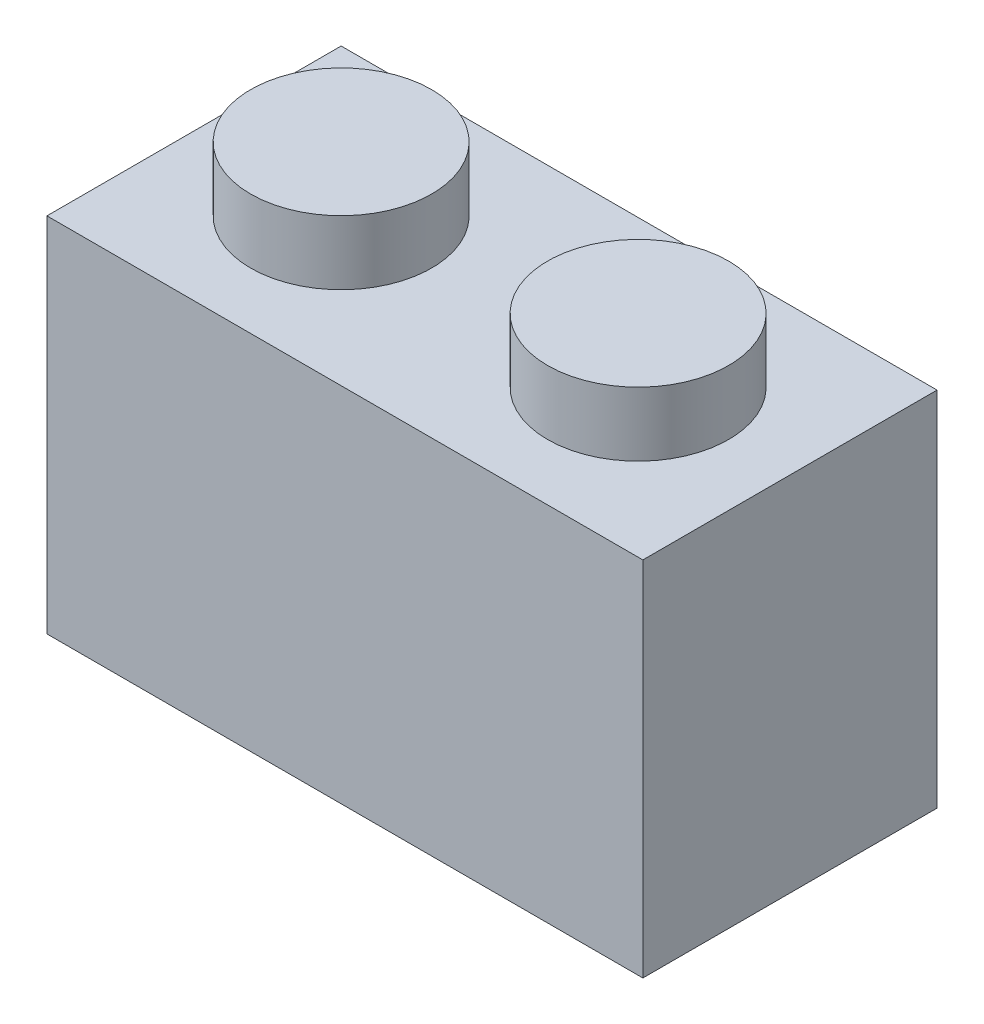
ISO-10303-21;
HEADER;
FILE_DESCRIPTION(('STEP AP214'),'2;1');
FILE_NAME('part.step','',(''),(''),'','','');
FILE_SCHEMA(('AUTOMOTIVE_DESIGN { 1 0 10303 214 1 1 1 1 }'));
ENDSEC;
DATA;
#1=APPLICATION_CONTEXT('core data for automotive mechanical design processes');
#2=APPLICATION_PROTOCOL_DEFINITION('international standard','automotive_design',2000,#1);
#3=PRODUCT_CONTEXT('',#1,'mechanical');
#4=PRODUCT('Part','Part','',(#3));
#5=PRODUCT_RELATED_PRODUCT_CATEGORY('part','',(#4));
#6=PRODUCT_DEFINITION_FORMATION('','',#4);
#7=PRODUCT_DEFINITION_CONTEXT('part definition',#1,'design');
#8=PRODUCT_DEFINITION('design','',#6,#7);
#9=PRODUCT_DEFINITION_SHAPE('','',#8);
#10=(LENGTH_UNIT() NAMED_UNIT(*) SI_UNIT(.MILLI.,.METRE.));
#11=(NAMED_UNIT(*) PLANE_ANGLE_UNIT() SI_UNIT($,.RADIAN.));
#12=(NAMED_UNIT(*) SI_UNIT($,.STERADIAN.) SOLID_ANGLE_UNIT());
#13=UNCERTAINTY_MEASURE_WITH_UNIT(LENGTH_MEASURE(1.E-05),#10,'distance_accuracy_value','');
#14=(GEOMETRIC_REPRESENTATION_CONTEXT(3) GLOBAL_UNCERTAINTY_ASSIGNED_CONTEXT((#13)) GLOBAL_UNIT_ASSIGNED_CONTEXT((#10,
#11,#12)) REPRESENTATION_CONTEXT('',''));
#15=CARTESIAN_POINT('',(0.,0.,0.));
#16=DIRECTION('',(0.,0.,1.));
#17=DIRECTION('',(1.,0.,0.));
#18=AXIS2_PLACEMENT_3D('',#15,#16,#17);
#19=CARTESIAN_POINT('',(-7.90000000000003,9.6,3.89999994699998));
#20=DIRECTION('',(1.,0.,0.));
#21=DIRECTION('',(0.,0.,-1.));
#22=AXIS2_PLACEMENT_3D('',#19,#20,#21);
#23=PLANE('',#22);
#24=DIRECTION('',(0.,0.,1.));
#25=VECTOR('',#24,1.);
#26=CARTESIAN_POINT('',(-7.90000000000003,0.,3.89999994699998));
#27=LINE('',#26,#25);
#28=CARTESIAN_POINT('',(-7.90000000000003,0.,-3.89999994700002));
#29=VERTEX_POINT('',#28);
#30=CARTESIAN_POINT('',(-7.90000000000003,0.,3.89999994699998));
#31=VERTEX_POINT('',#30);
#32=EDGE_CURVE('E96',#29,#31,#27,.T.);
#33=ORIENTED_EDGE('',*,*,#32,.T.);
#34=DIRECTION('',(0.,-1.,0.));
#35=VECTOR('',#34,1.);
#36=CARTESIAN_POINT('',(-7.90000000000003,9.6,3.89999994699998));
#37=LINE('',#36,#35);
#38=CARTESIAN_POINT('',(-7.90000000000003,9.6,3.89999994699998));
#39=VERTEX_POINT('',#38);
#40=EDGE_CURVE('E11',#39,#31,#37,.T.);
#41=ORIENTED_EDGE('',*,*,#40,.F.);
#42=DIRECTION('',(0.,0.,1.));
#43=VECTOR('',#42,1.);
#44=CARTESIAN_POINT('',(-7.90000000000003,9.6,3.89999994699998));
#45=LINE('',#44,#43);
#46=CARTESIAN_POINT('',(-7.90000000000003,9.6,-3.89999994700002));
#47=VERTEX_POINT('',#46);
#48=EDGE_CURVE('E84',#47,#39,#45,.T.);
#49=ORIENTED_EDGE('',*,*,#48,.F.);
#50=DIRECTION('',(0.,-1.,0.));
#51=VECTOR('',#50,1.);
#52=CARTESIAN_POINT('',(-7.90000000000003,9.6,-3.89999994700002));
#53=LINE('',#52,#51);
#54=EDGE_CURVE('E92',#47,#29,#53,.T.);
#55=ORIENTED_EDGE('',*,*,#54,.T.);
#56=EDGE_LOOP('',(#33,#41,#49,#55));
#57=FACE_BOUND('',#56,.T.);
#58=ADVANCED_FACE('F33',(#57),#23,.F.);
#59=CARTESIAN_POINT('',(7.89999999999997,9.6,3.89999994699998));
#60=DIRECTION('',(0.,0.,-1.));
#61=DIRECTION('',(-1.,0.,0.));
#62=AXIS2_PLACEMENT_3D('',#59,#60,#61);
#63=PLANE('',#62);
#64=DIRECTION('',(1.,0.,0.));
#65=VECTOR('',#64,1.);
#66=CARTESIAN_POINT('',(7.89999999999997,0.,3.89999994699998));
#67=LINE('',#66,#65);
#68=CARTESIAN_POINT('',(7.89999999999997,0.,3.89999994699998));
#69=VERTEX_POINT('',#68);
#70=EDGE_CURVE('E88',#31,#69,#67,.T.);
#71=ORIENTED_EDGE('',*,*,#70,.T.);
#72=DIRECTION('',(0.,-1.,0.));
#73=VECTOR('',#72,1.);
#74=CARTESIAN_POINT('',(7.89999999999997,9.6,3.89999994699998));
#75=LINE('',#74,#73);
#76=CARTESIAN_POINT('',(7.89999999999997,9.6,3.89999994699998));
#77=VERTEX_POINT('',#76);
#78=EDGE_CURVE('E41',#77,#69,#75,.T.);
#79=ORIENTED_EDGE('',*,*,#78,.F.);
#80=DIRECTION('',(1.,0.,0.));
#81=VECTOR('',#80,1.);
#82=CARTESIAN_POINT('',(7.89999999999997,9.6,3.89999994699998));
#83=LINE('',#82,#81);
#84=EDGE_CURVE('E79',#39,#77,#83,.T.);
#85=ORIENTED_EDGE('',*,*,#84,.F.);
#86=ORIENTED_EDGE('',*,*,#40,.T.);
#87=EDGE_LOOP('',(#71,#79,#85,#86));
#88=FACE_BOUND('',#87,.T.);
#89=ADVANCED_FACE('F87',(#88),#63,.F.);
#90=CARTESIAN_POINT('',(7.89999999999997,9.6,3.89999994699998));
#91=DIRECTION('',(-1.,0.,0.));
#92=DIRECTION('',(0.,0.,1.));
#93=AXIS2_PLACEMENT_3D('',#90,#91,#92);
#94=PLANE('',#93);
#95=DIRECTION('',(0.,0.,-1.));
#96=VECTOR('',#95,1.);
#97=CARTESIAN_POINT('',(7.89999999999997,0.,3.89999994699998));
#98=LINE('',#97,#96);
#99=CARTESIAN_POINT('',(7.89999999999997,0.,-3.89999994700002));
#100=VERTEX_POINT('',#99);
#101=EDGE_CURVE('E66',#69,#100,#98,.T.);
#102=ORIENTED_EDGE('',*,*,#101,.T.);
#103=DIRECTION('',(0.,-1.,0.));
#104=VECTOR('',#103,1.);
#105=CARTESIAN_POINT('',(7.89999999999997,9.6,-3.89999994700002));
#106=LINE('',#105,#104);
#107=CARTESIAN_POINT('',(7.89999999999997,9.6,-3.89999994700002));
#108=VERTEX_POINT('',#107);
#109=EDGE_CURVE('E89',#108,#100,#106,.T.);
#110=ORIENTED_EDGE('',*,*,#109,.F.);
#111=DIRECTION('',(0.,0.,-1.));
#112=VECTOR('',#111,1.);
#113=CARTESIAN_POINT('',(7.89999999999997,9.6,3.89999994699998));
#114=LINE('',#113,#112);
#115=EDGE_CURVE('E82',#77,#108,#114,.T.);
#116=ORIENTED_EDGE('',*,*,#115,.F.);
#117=ORIENTED_EDGE('',*,*,#78,.T.);
#118=EDGE_LOOP('',(#102,#110,#116,#117));
#119=FACE_BOUND('',#118,.T.);
#120=ADVANCED_FACE('F90',(#119),#94,.F.);
#121=CARTESIAN_POINT('',(7.89999999999997,9.6,-3.89999994700002));
#122=DIRECTION('',(0.,0.,1.));
#123=DIRECTION('',(1.,0.,0.));
#124=AXIS2_PLACEMENT_3D('',#121,#122,#123);
#125=PLANE('',#124);
#126=DIRECTION('',(-1.,0.,0.));
#127=VECTOR('',#126,1.);
#128=CARTESIAN_POINT('',(7.89999999999997,0.,-3.89999994700002));
#129=LINE('',#128,#127);
#130=EDGE_CURVE('E72',#100,#29,#129,.T.);
#131=ORIENTED_EDGE('',*,*,#130,.T.);
#132=ORIENTED_EDGE('',*,*,#54,.F.);
#133=DIRECTION('',(-1.,0.,0.));
#134=VECTOR('',#133,1.);
#135=CARTESIAN_POINT('',(7.89999999999997,9.6,-3.89999994700002));
#136=LINE('',#135,#134);
#137=EDGE_CURVE('E49',#108,#47,#136,.T.);
#138=ORIENTED_EDGE('',*,*,#137,.F.);
#139=ORIENTED_EDGE('',*,*,#109,.T.);
#140=EDGE_LOOP('',(#131,#132,#138,#139));
#141=FACE_BOUND('',#140,.T.);
#142=ADVANCED_FACE('F104',(#141),#125,.F.);
#143=CARTESIAN_POINT('',(0.,9.6,0.));
#144=DIRECTION('',(0.,1.,0.));
#145=DIRECTION('',(0.,0.,1.));
#146=AXIS2_PLACEMENT_3D('',#143,#144,#145);
#147=PLANE('',#146);
#148=CARTESIAN_POINT('',(3.87399999999997,9.6,5.29999785378599E-08));
#149=DIRECTION('',(0.,1.,0.));
#150=DIRECTION('',(0.,0.,1.));
#151=AXIS2_PLACEMENT_3D('',#148,#149,#150);
#152=CIRCLE('',#151,2.4);
#153=CARTESIAN_POINT('',(3.87399999999997,9.6,2.40000005299998));
#154=VERTEX_POINT('',#153);
#155=EDGE_CURVE('E116',#154,#154,#152,.T.);
#156=ORIENTED_EDGE('',*,*,#155,.F.);
#157=EDGE_LOOP('',(#156));
#158=FACE_BOUND('',#157,.T.);
#159=CARTESIAN_POINT('',(-4.00000000000003,9.6,5.29999785378599E-08));
#160=DIRECTION('',(0.,1.,0.));
#161=DIRECTION('',(0.,0.,1.));
#162=AXIS2_PLACEMENT_3D('',#159,#160,#161);
#163=CIRCLE('',#162,2.4);
#164=CARTESIAN_POINT('',(-4.00000000000003,9.6,2.40000005299998));
#165=VERTEX_POINT('',#164);
#166=EDGE_CURVE('E110',#165,#165,#163,.T.);
#167=ORIENTED_EDGE('',*,*,#166,.F.);
#168=EDGE_LOOP('',(#167));
#169=FACE_BOUND('',#168,.T.);
#170=ORIENTED_EDGE('',*,*,#48,.T.);
#171=ORIENTED_EDGE('',*,*,#84,.T.);
#172=ORIENTED_EDGE('',*,*,#115,.T.);
#173=ORIENTED_EDGE('',*,*,#137,.T.);
#174=EDGE_LOOP('',(#170,#171,#172,#173));
#175=FACE_BOUND('',#174,.T.);
#176=ADVANCED_FACE('F80',(#158,#169,#175),#147,.T.);
#177=CARTESIAN_POINT('',(0.,0.,0.));
#178=DIRECTION('',(0.,1.,0.));
#179=DIRECTION('',(0.,0.,1.));
#180=AXIS2_PLACEMENT_3D('',#177,#178,#179);
#181=PLANE('',#180);
#182=CARTESIAN_POINT('',(-4.00000000000003,0.,5.29999785378599E-08));
#183=DIRECTION('',(0.,-1.,0.));
#184=DIRECTION('',(0.,0.,-1.));
#185=AXIS2_PLACEMENT_3D('',#182,#183,#184);
#186=CIRCLE('',#185,2.5);
#187=CARTESIAN_POINT('',(-4.00000000000003,0.,-2.49999994700002));
#188=VERTEX_POINT('',#187);
#189=EDGE_CURVE('E128',#188,#188,#186,.T.);
#190=ORIENTED_EDGE('',*,*,#189,.F.);
#191=EDGE_LOOP('',(#190));
#192=FACE_BOUND('',#191,.T.);
#193=CARTESIAN_POINT('',(3.87399999999997,0.,5.29999785378599E-08));
#194=DIRECTION('',(0.,-1.,0.));
#195=DIRECTION('',(0.,0.,-1.));
#196=AXIS2_PLACEMENT_3D('',#193,#194,#195);
#197=CIRCLE('',#196,2.5);
#198=CARTESIAN_POINT('',(3.87399999999997,0.,-2.49999994700002));
#199=VERTEX_POINT('',#198);
#200=EDGE_CURVE('E122',#199,#199,#197,.T.);
#201=ORIENTED_EDGE('',*,*,#200,.F.);
#202=EDGE_LOOP('',(#201));
#203=FACE_BOUND('',#202,.T.);
#204=ORIENTED_EDGE('',*,*,#32,.F.);
#205=ORIENTED_EDGE('',*,*,#130,.F.);
#206=ORIENTED_EDGE('',*,*,#101,.F.);
#207=ORIENTED_EDGE('',*,*,#70,.F.);
#208=EDGE_LOOP('',(#204,#205,#206,#207));
#209=FACE_BOUND('',#208,.T.);
#210=ADVANCED_FACE('F107',(#192,#203,#209),#181,.F.);
#211=CARTESIAN_POINT('',(-4.00000000000003,11.3,5.29999785378599E-08));
#212=DIRECTION('',(0.,-1.,0.));
#213=DIRECTION('',(0.,0.,-1.));
#214=AXIS2_PLACEMENT_3D('',#211,#212,#213);
#215=CYLINDRICAL_SURFACE('',#214,2.4);
#216=CARTESIAN_POINT('',(-4.00000000000003,11.3,5.29999785378599E-08));
#217=DIRECTION('',(0.,1.,0.));
#218=DIRECTION('',(0.,0.,1.));
#219=AXIS2_PLACEMENT_3D('',#216,#217,#218);
#220=CIRCLE('',#219,2.4);
#221=CARTESIAN_POINT('',(-4.00000000000003,11.3,2.40000005299998));
#222=VERTEX_POINT('',#221);
#223=EDGE_CURVE('E99',#222,#222,#220,.T.);
#224=ORIENTED_EDGE('',*,*,#223,.F.);
#225=EDGE_LOOP('',(#224));
#226=FACE_BOUND('',#225,.T.);
#227=ORIENTED_EDGE('',*,*,#166,.T.);
#228=EDGE_LOOP('',(#227));
#229=FACE_BOUND('',#228,.T.);
#230=ADVANCED_FACE('F145',(#226,#229),#215,.T.);
#231=CARTESIAN_POINT('',(-4.00000000000003,11.3,5.29999785378599E-08));
#232=DIRECTION('',(0.,1.,0.));
#233=DIRECTION('',(0.,0.,1.));
#234=AXIS2_PLACEMENT_3D('',#231,#232,#233);
#235=PLANE('',#234);
#236=ORIENTED_EDGE('',*,*,#223,.T.);
#237=EDGE_LOOP('',(#236));
#238=FACE_BOUND('',#237,.T.);
#239=ADVANCED_FACE('F180',(#238),#235,.T.);
#240=CARTESIAN_POINT('',(3.87399999999997,11.3,5.29999785378599E-08));
#241=DIRECTION('',(0.,-1.,0.));
#242=DIRECTION('',(0.,0.,-1.));
#243=AXIS2_PLACEMENT_3D('',#240,#241,#242);
#244=CYLINDRICAL_SURFACE('',#243,2.4);
#245=CARTESIAN_POINT('',(3.87399999999997,11.3,5.29999785378599E-08));
#246=DIRECTION('',(0.,1.,0.));
#247=DIRECTION('',(0.,0.,1.));
#248=AXIS2_PLACEMENT_3D('',#245,#246,#247);
#249=CIRCLE('',#248,2.4);
#250=CARTESIAN_POINT('',(3.87399999999997,11.3,2.40000005299998));
#251=VERTEX_POINT('',#250);
#252=EDGE_CURVE('E113',#251,#251,#249,.T.);
#253=ORIENTED_EDGE('',*,*,#252,.F.);
#254=EDGE_LOOP('',(#253));
#255=FACE_BOUND('',#254,.T.);
#256=ORIENTED_EDGE('',*,*,#155,.T.);
#257=EDGE_LOOP('',(#256));
#258=FACE_BOUND('',#257,.T.);
#259=ADVANCED_FACE('F160',(#255,#258),#244,.T.);
#260=CARTESIAN_POINT('',(3.87399999999997,11.3,5.29999785378599E-08));
#261=DIRECTION('',(0.,1.,0.));
#262=DIRECTION('',(0.,0.,1.));
#263=AXIS2_PLACEMENT_3D('',#260,#261,#262);
#264=PLANE('',#263);
#265=ORIENTED_EDGE('',*,*,#252,.T.);
#266=EDGE_LOOP('',(#265));
#267=FACE_BOUND('',#266,.T.);
#268=ADVANCED_FACE('F151',(#267),#264,.T.);
#269=CARTESIAN_POINT('',(3.87399999999997,1.8,5.29999785378599E-08));
#270=DIRECTION('',(0.,-1.,0.));
#271=DIRECTION('',(0.,0.,-1.));
#272=AXIS2_PLACEMENT_3D('',#269,#270,#271);
#273=CYLINDRICAL_SURFACE('',#272,2.5);
#274=CARTESIAN_POINT('',(3.87399999999997,1.8,5.29999785378599E-08));
#275=DIRECTION('',(0.,-1.,0.));
#276=DIRECTION('',(0.,0.,-1.));
#277=AXIS2_PLACEMENT_3D('',#274,#275,#276);
#278=CIRCLE('',#277,2.5);
#279=CARTESIAN_POINT('',(3.87399999999997,1.8,-2.49999994700002));
#280=VERTEX_POINT('',#279);
#281=EDGE_CURVE('E125',#280,#280,#278,.T.);
#282=ORIENTED_EDGE('',*,*,#281,.F.);
#283=EDGE_LOOP('',(#282));
#284=FACE_BOUND('',#283,.T.);
#285=ORIENTED_EDGE('',*,*,#200,.T.);
#286=EDGE_LOOP('',(#285));
#287=FACE_BOUND('',#286,.T.);
#288=ADVANCED_FACE('F149',(#284,#287),#273,.F.);
#289=CARTESIAN_POINT('',(3.87399999999997,1.8,5.29999785378599E-08));
#290=DIRECTION('',(0.,-1.,0.));
#291=DIRECTION('',(0.,0.,-1.));
#292=AXIS2_PLACEMENT_3D('',#289,#290,#291);
#293=PLANE('',#292);
#294=ORIENTED_EDGE('',*,*,#281,.T.);
#295=EDGE_LOOP('',(#294));
#296=FACE_BOUND('',#295,.T.);
#297=ADVANCED_FACE('F139',(#296),#293,.T.);
#298=CARTESIAN_POINT('',(-4.00000000000003,1.8,5.29999785378599E-08));
#299=DIRECTION('',(0.,-1.,0.));
#300=DIRECTION('',(0.,0.,-1.));
#301=AXIS2_PLACEMENT_3D('',#298,#299,#300);
#302=CYLINDRICAL_SURFACE('',#301,2.5);
#303=CARTESIAN_POINT('',(-4.00000000000003,1.8,5.29999785378599E-08));
#304=DIRECTION('',(0.,-1.,0.));
#305=DIRECTION('',(0.,0.,-1.));
#306=AXIS2_PLACEMENT_3D('',#303,#304,#305);
#307=CIRCLE('',#306,2.5);
#308=CARTESIAN_POINT('',(-4.00000000000003,1.8,-2.49999994700002));
#309=VERTEX_POINT('',#308);
#310=EDGE_CURVE('E119',#309,#309,#307,.T.);
#311=ORIENTED_EDGE('',*,*,#310,.F.);
#312=EDGE_LOOP('',(#311));
#313=FACE_BOUND('',#312,.T.);
#314=ORIENTED_EDGE('',*,*,#189,.T.);
#315=EDGE_LOOP('',(#314));
#316=FACE_BOUND('',#315,.T.);
#317=ADVANCED_FACE('F136',(#313,#316),#302,.F.);
#318=CARTESIAN_POINT('',(-4.00000000000003,1.8,5.29999785378599E-08));
#319=DIRECTION('',(0.,-1.,0.));
#320=DIRECTION('',(0.,0.,-1.));
#321=AXIS2_PLACEMENT_3D('',#318,#319,#320);
#322=PLANE('',#321);
#323=ORIENTED_EDGE('',*,*,#310,.T.);
#324=EDGE_LOOP('',(#323));
#325=FACE_BOUND('',#324,.T.);
#326=ADVANCED_FACE('F134',(#325),#322,.T.);
#327=CLOSED_SHELL('',(#58,#89,#120,#142,#176,#210,#230,#239,#259,#268,#288,#297,#317,#326));
#328=MANIFOLD_SOLID_BREP('B2',#327);
#329=ADVANCED_BREP_SHAPE_REPRESENTATION('',(#18,#328),#14);
#330=SHAPE_DEFINITION_REPRESENTATION(#9,#329);
ENDSEC;
END-ISO-10303-21;
